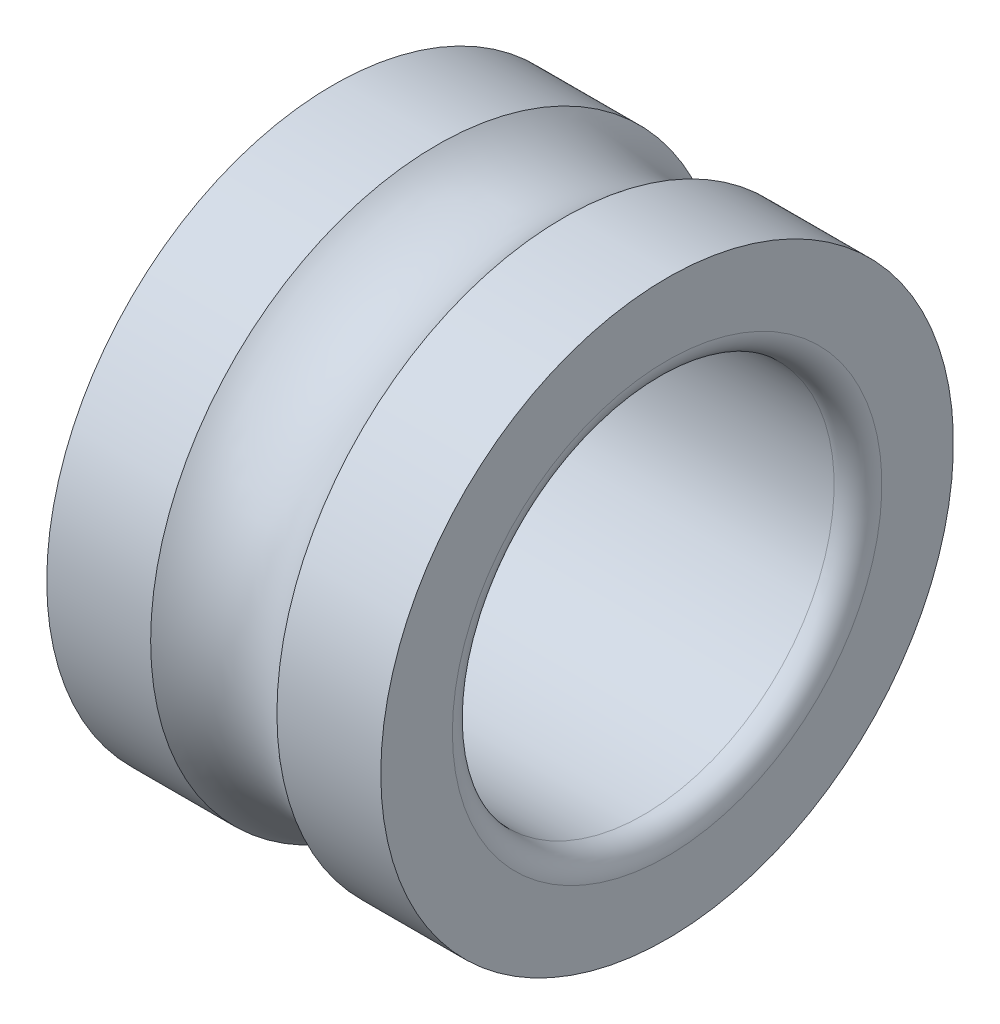
ISO-10303-21;
HEADER;
FILE_DESCRIPTION(('STEP AP214'),'2;1');
FILE_NAME('part.step','',(''),(''),'','','');
FILE_SCHEMA(('AUTOMOTIVE_DESIGN { 1 0 10303 214 1 1 1 1 }'));
ENDSEC;
DATA;
#1=APPLICATION_CONTEXT('core data for automotive mechanical design processes');
#2=APPLICATION_PROTOCOL_DEFINITION('international standard','automotive_design',2000,#1);
#3=PRODUCT_CONTEXT('',#1,'mechanical');
#4=PRODUCT('Part','Part','',(#3));
#5=PRODUCT_RELATED_PRODUCT_CATEGORY('part','',(#4));
#6=PRODUCT_DEFINITION_FORMATION('','',#4);
#7=PRODUCT_DEFINITION_CONTEXT('part definition',#1,'design');
#8=PRODUCT_DEFINITION('design','',#6,#7);
#9=PRODUCT_DEFINITION_SHAPE('','',#8);
#10=(LENGTH_UNIT() NAMED_UNIT(*) SI_UNIT(.MILLI.,.METRE.));
#11=(NAMED_UNIT(*) PLANE_ANGLE_UNIT() SI_UNIT($,.RADIAN.));
#12=(NAMED_UNIT(*) SI_UNIT($,.STERADIAN.) SOLID_ANGLE_UNIT());
#13=UNCERTAINTY_MEASURE_WITH_UNIT(LENGTH_MEASURE(1.E-05),#10,'distance_accuracy_value','');
#14=(GEOMETRIC_REPRESENTATION_CONTEXT(3) GLOBAL_UNCERTAINTY_ASSIGNED_CONTEXT((#13)) GLOBAL_UNIT_ASSIGNED_CONTEXT((#10,
#11,#12)) REPRESENTATION_CONTEXT('',''));
#15=CARTESIAN_POINT('',(0.,0.,0.));
#16=DIRECTION('',(0.,0.,1.));
#17=DIRECTION('',(1.,0.,0.));
#18=AXIS2_PLACEMENT_3D('',#15,#16,#17);
#19=CARTESIAN_POINT('',(0.,0.,0.));
#20=DIRECTION('',(-1.,0.,0.));
#21=DIRECTION('',(0.,0.,1.));
#22=AXIS2_PLACEMENT_3D('',#19,#20,#21);
#23=CYLINDRICAL_SURFACE('',#22,6.);
#24=CARTESIAN_POINT('',(1.3228756555323,0.,0.));
#25=DIRECTION('',(-1.,0.,0.));
#26=DIRECTION('',(0.,0.,1.));
#27=AXIS2_PLACEMENT_3D('',#24,#25,#26);
#28=CIRCLE('',#27,6.);
#29=CARTESIAN_POINT('',(1.3228756555323,0.,6.));
#30=VERTEX_POINT('',#29);
#31=EDGE_CURVE('E376',#30,#30,#28,.T.);
#32=ORIENTED_EDGE('',*,*,#31,.F.);
#33=EDGE_LOOP('',(#32));
#34=FACE_BOUND('',#33,.T.);
#35=CARTESIAN_POINT('',(3.5,0.,0.));
#36=DIRECTION('',(-1.,0.,0.));
#37=DIRECTION('',(0.,0.,1.));
#38=AXIS2_PLACEMENT_3D('',#35,#36,#37);
#39=CIRCLE('',#38,6.);
#40=CARTESIAN_POINT('',(3.5,0.,6.));
#41=VERTEX_POINT('',#40);
#42=EDGE_CURVE('E10',#41,#41,#39,.T.);
#43=ORIENTED_EDGE('',*,*,#42,.T.);
#44=EDGE_LOOP('',(#43));
#45=FACE_BOUND('',#44,.T.);
#46=ADVANCED_FACE('F348',(#34,#45),#23,.T.);
#47=CARTESIAN_POINT('',(3.5,4.5,0.));
#48=DIRECTION('',(-1.,0.,0.));
#49=DIRECTION('',(0.,0.,1.));
#50=AXIS2_PLACEMENT_3D('',#47,#48,#49);
#51=PLANE('',#50);
#52=ORIENTED_EDGE('',*,*,#42,.F.);
#53=EDGE_LOOP('',(#52));
#54=FACE_BOUND('',#53,.T.);
#55=CARTESIAN_POINT('',(3.5,0.,0.));
#56=DIRECTION('',(-1.,0.,0.));
#57=DIRECTION('',(0.,0.,1.));
#58=AXIS2_PLACEMENT_3D('',#55,#56,#57);
#59=CIRCLE('',#58,4.5);
#60=CARTESIAN_POINT('',(3.5,0.,4.5));
#61=VERTEX_POINT('',#60);
#62=EDGE_CURVE('E354',#61,#61,#59,.T.);
#63=ORIENTED_EDGE('',*,*,#62,.T.);
#64=EDGE_LOOP('',(#63));
#65=FACE_BOUND('',#64,.T.);
#66=ADVANCED_FACE('F383',(#54,#65),#51,.F.);
#67=CARTESIAN_POINT('',(3.,0.,0.));
#68=DIRECTION('',(-1.,0.,0.));
#69=DIRECTION('',(0.,0.,1.));
#70=AXIS2_PLACEMENT_3D('',#67,#68,#69);
#71=TOROIDAL_SURFACE('',#70,4.5,0.5);
#72=ORIENTED_EDGE('',*,*,#62,.F.);
#73=EDGE_LOOP('',(#72));
#74=FACE_BOUND('',#73,.T.);
#75=CARTESIAN_POINT('',(3.,0.,0.));
#76=DIRECTION('',(-1.,0.,0.));
#77=DIRECTION('',(0.,0.,1.));
#78=AXIS2_PLACEMENT_3D('',#75,#76,#77);
#79=CIRCLE('',#78,4.);
#80=CARTESIAN_POINT('',(3.,0.,4.));
#81=VERTEX_POINT('',#80);
#82=EDGE_CURVE('E358',#81,#81,#79,.T.);
#83=ORIENTED_EDGE('',*,*,#82,.T.);
#84=EDGE_LOOP('',(#83));
#85=FACE_BOUND('',#84,.T.);
#86=ADVANCED_FACE('F387',(#74,#85),#71,.T.);
#87=CARTESIAN_POINT('',(0.,0.,0.));
#88=DIRECTION('',(-1.,0.,0.));
#89=DIRECTION('',(0.,0.,1.));
#90=AXIS2_PLACEMENT_3D('',#87,#88,#89);
#91=CYLINDRICAL_SURFACE('',#90,4.);
#92=ORIENTED_EDGE('',*,*,#82,.F.);
#93=EDGE_LOOP('',(#92));
#94=FACE_BOUND('',#93,.T.);
#95=CARTESIAN_POINT('',(-3.,0.,0.));
#96=DIRECTION('',(-1.,0.,0.));
#97=DIRECTION('',(0.,0.,1.));
#98=AXIS2_PLACEMENT_3D('',#95,#96,#97);
#99=CIRCLE('',#98,4.);
#100=CARTESIAN_POINT('',(-3.,0.,4.));
#101=VERTEX_POINT('',#100);
#102=EDGE_CURVE('E362',#101,#101,#99,.T.);
#103=ORIENTED_EDGE('',*,*,#102,.T.);
#104=EDGE_LOOP('',(#103));
#105=FACE_BOUND('',#104,.T.);
#106=ADVANCED_FACE('F392',(#94,#105),#91,.F.);
#107=CARTESIAN_POINT('',(-3.,0.,0.));
#108=DIRECTION('',(-1.,0.,0.));
#109=DIRECTION('',(0.,0.,1.));
#110=AXIS2_PLACEMENT_3D('',#107,#108,#109);
#111=TOROIDAL_SURFACE('',#110,4.5,0.5);
#112=ORIENTED_EDGE('',*,*,#102,.F.);
#113=EDGE_LOOP('',(#112));
#114=FACE_BOUND('',#113,.T.);
#115=CARTESIAN_POINT('',(-3.5,0.,0.));
#116=DIRECTION('',(-1.,0.,0.));
#117=DIRECTION('',(0.,0.,1.));
#118=AXIS2_PLACEMENT_3D('',#115,#116,#117);
#119=CIRCLE('',#118,4.5);
#120=CARTESIAN_POINT('',(-3.5,0.,4.5));
#121=VERTEX_POINT('',#120);
#122=EDGE_CURVE('E367',#121,#121,#119,.T.);
#123=ORIENTED_EDGE('',*,*,#122,.T.);
#124=EDGE_LOOP('',(#123));
#125=FACE_BOUND('',#124,.T.);
#126=ADVANCED_FACE('F398',(#114,#125),#111,.T.);
#127=CARTESIAN_POINT('',(-3.5,4.5,0.));
#128=DIRECTION('',(1.,0.,0.));
#129=DIRECTION('',(0.,0.,-1.));
#130=AXIS2_PLACEMENT_3D('',#127,#128,#129);
#131=PLANE('',#130);
#132=ORIENTED_EDGE('',*,*,#122,.F.);
#133=EDGE_LOOP('',(#132));
#134=FACE_BOUND('',#133,.T.);
#135=CARTESIAN_POINT('',(-3.5,0.,0.));
#136=DIRECTION('',(-1.,0.,0.));
#137=DIRECTION('',(0.,0.,1.));
#138=AXIS2_PLACEMENT_3D('',#135,#136,#137);
#139=CIRCLE('',#138,6.);
#140=CARTESIAN_POINT('',(-3.5,0.,6.));
#141=VERTEX_POINT('',#140);
#142=EDGE_CURVE('E370',#141,#141,#139,.T.);
#143=ORIENTED_EDGE('',*,*,#142,.T.);
#144=EDGE_LOOP('',(#143));
#145=FACE_BOUND('',#144,.T.);
#146=ADVANCED_FACE('F402',(#134,#145),#131,.F.);
#147=CARTESIAN_POINT('',(0.,0.,0.));
#148=DIRECTION('',(-1.,0.,0.));
#149=DIRECTION('',(0.,0.,1.));
#150=AXIS2_PLACEMENT_3D('',#147,#148,#149);
#151=CYLINDRICAL_SURFACE('',#150,6.);
#152=ORIENTED_EDGE('',*,*,#142,.F.);
#153=EDGE_LOOP('',(#152));
#154=FACE_BOUND('',#153,.T.);
#155=CARTESIAN_POINT('',(-1.3228756555323,0.,0.));
#156=DIRECTION('',(-1.,0.,0.));
#157=DIRECTION('',(0.,0.,1.));
#158=AXIS2_PLACEMENT_3D('',#155,#156,#157);
#159=CIRCLE('',#158,6.);
#160=CARTESIAN_POINT('',(-1.3228756555323,0.,6.));
#161=VERTEX_POINT('',#160);
#162=EDGE_CURVE('E373',#161,#161,#159,.T.);
#163=ORIENTED_EDGE('',*,*,#162,.T.);
#164=EDGE_LOOP('',(#163));
#165=FACE_BOUND('',#164,.T.);
#166=ADVANCED_FACE('F406',(#154,#165),#151,.T.);
#167=CARTESIAN_POINT('',(0.,0.,0.));
#168=DIRECTION('',(-1.,0.,0.));
#169=DIRECTION('',(0.,0.,1.));
#170=AXIS2_PLACEMENT_3D('',#167,#168,#169);
#171=TOROIDAL_SURFACE('',#170,7.5,2.);
#172=ORIENTED_EDGE('',*,*,#162,.F.);
#173=EDGE_LOOP('',(#172));
#174=FACE_BOUND('',#173,.T.);
#175=ORIENTED_EDGE('',*,*,#31,.T.);
#176=EDGE_LOOP('',(#175));
#177=FACE_BOUND('',#176,.T.);
#178=ADVANCED_FACE('F380',(#174,#177),#171,.F.);
#179=CLOSED_SHELL('',(#46,#66,#86,#106,#126,#146,#166,#178));
#180=MANIFOLD_SOLID_BREP('B2',#179);
#181=ADVANCED_BREP_SHAPE_REPRESENTATION('',(#18,#180),#14);
#182=SHAPE_DEFINITION_REPRESENTATION(#9,#181);
ENDSEC;
END-ISO-10303-21;
